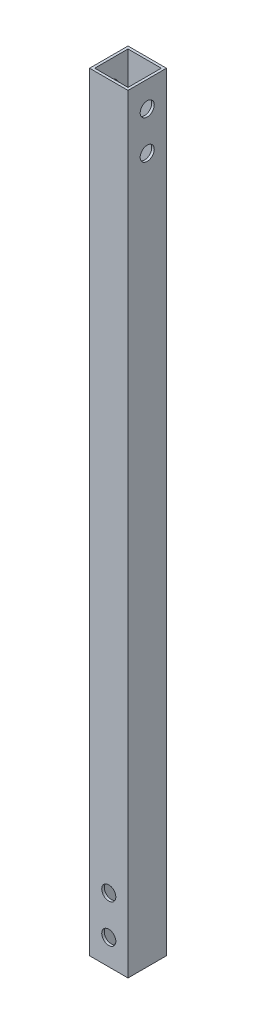
ISO-10303-21;
HEADER;
FILE_DESCRIPTION(('STEP AP214'),'2;1');
FILE_NAME('part.step','',(''),(''),'','','');
FILE_SCHEMA(('AUTOMOTIVE_DESIGN { 1 0 10303 214 1 1 1 1 }'));
ENDSEC;
DATA;
#1=APPLICATION_CONTEXT('core data for automotive mechanical design processes');
#2=APPLICATION_PROTOCOL_DEFINITION('international standard','automotive_design',2000,#1);
#3=PRODUCT_CONTEXT('',#1,'mechanical');
#4=PRODUCT('Part','Part','',(#3));
#5=PRODUCT_RELATED_PRODUCT_CATEGORY('part','',(#4));
#6=PRODUCT_DEFINITION_FORMATION('','',#4);
#7=PRODUCT_DEFINITION_CONTEXT('part definition',#1,'design');
#8=PRODUCT_DEFINITION('design','',#6,#7);
#9=PRODUCT_DEFINITION_SHAPE('','',#8);
#10=(LENGTH_UNIT() NAMED_UNIT(*) SI_UNIT(.MILLI.,.METRE.));
#11=(NAMED_UNIT(*) PLANE_ANGLE_UNIT() SI_UNIT($,.RADIAN.));
#12=(NAMED_UNIT(*) SI_UNIT($,.STERADIAN.) SOLID_ANGLE_UNIT());
#13=UNCERTAINTY_MEASURE_WITH_UNIT(LENGTH_MEASURE(1.E-05),#10,'distance_accuracy_value','');
#14=(GEOMETRIC_REPRESENTATION_CONTEXT(3) GLOBAL_UNCERTAINTY_ASSIGNED_CONTEXT((#13)) GLOBAL_UNIT_ASSIGNED_CONTEXT((#10,
#11,#12)) REPRESENTATION_CONTEXT('',''));
#15=CARTESIAN_POINT('',(0.,0.,0.));
#16=DIRECTION('',(0.,0.,1.));
#17=DIRECTION('',(1.,0.,0.));
#18=AXIS2_PLACEMENT_3D('',#15,#16,#17);
#19=CARTESIAN_POINT('',(7.5,300.,7.5));
#20=DIRECTION('',(0.,1.,0.));
#21=DIRECTION('',(0.,0.,-1.));
#22=AXIS2_PLACEMENT_3D('',#19,#20,#21);
#23=PLANE('',#22);
#24=DIRECTION('',(0.,0.,1.));
#25=VECTOR('',#24,1.);
#26=CARTESIAN_POINT('',(7.5,300.,-7.5));
#27=LINE('',#26,#25);
#28=CARTESIAN_POINT('',(7.5,300.,-7.5));
#29=VERTEX_POINT('',#28);
#30=CARTESIAN_POINT('',(7.5,300.,7.5));
#31=VERTEX_POINT('',#30);
#32=EDGE_CURVE('E154',#29,#31,#27,.T.);
#33=ORIENTED_EDGE('',*,*,#32,.F.);
#34=DIRECTION('',(1.,0.,0.));
#35=VECTOR('',#34,1.);
#36=CARTESIAN_POINT('',(7.5,300.,-7.5));
#37=LINE('',#36,#35);
#38=CARTESIAN_POINT('',(-7.5,300.,-7.5));
#39=VERTEX_POINT('',#38);
#40=EDGE_CURVE('E167',#39,#29,#37,.T.);
#41=ORIENTED_EDGE('',*,*,#40,.F.);
#42=DIRECTION('',(0.,0.,-1.));
#43=VECTOR('',#42,1.);
#44=CARTESIAN_POINT('',(-7.5,300.,-7.5));
#45=LINE('',#44,#43);
#46=CARTESIAN_POINT('',(-7.5,300.,7.5));
#47=VERTEX_POINT('',#46);
#48=EDGE_CURVE('E163',#47,#39,#45,.T.);
#49=ORIENTED_EDGE('',*,*,#48,.F.);
#50=DIRECTION('',(-1.,0.,0.));
#51=VECTOR('',#50,1.);
#52=CARTESIAN_POINT('',(7.5,300.,7.5));
#53=LINE('',#52,#51);
#54=EDGE_CURVE('E158',#31,#47,#53,.T.);
#55=ORIENTED_EDGE('',*,*,#54,.F.);
#56=EDGE_LOOP('',(#33,#41,#49,#55));
#57=FACE_BOUND('',#56,.T.);
#58=DIRECTION('',(1.,0.,0.));
#59=VECTOR('',#58,1.);
#60=CARTESIAN_POINT('',(6.5,300.,-6.5));
#61=LINE('',#60,#59);
#62=CARTESIAN_POINT('',(-6.5,300.,-6.5));
#63=VERTEX_POINT('',#62);
#64=CARTESIAN_POINT('',(6.5,300.,-6.5));
#65=VERTEX_POINT('',#64);
#66=EDGE_CURVE('E121',#63,#65,#61,.T.);
#67=ORIENTED_EDGE('',*,*,#66,.T.);
#68=DIRECTION('',(0.,0.,1.));
#69=VECTOR('',#68,1.);
#70=CARTESIAN_POINT('',(6.5,300.,-6.5));
#71=LINE('',#70,#69);
#72=CARTESIAN_POINT('',(6.5,300.,6.5));
#73=VERTEX_POINT('',#72);
#74=EDGE_CURVE('E128',#65,#73,#71,.T.);
#75=ORIENTED_EDGE('',*,*,#74,.T.);
#76=DIRECTION('',(-1.,0.,0.));
#77=VECTOR('',#76,1.);
#78=CARTESIAN_POINT('',(6.5,300.,6.5));
#79=LINE('',#78,#77);
#80=CARTESIAN_POINT('',(-6.5,300.,6.5));
#81=VERTEX_POINT('',#80);
#82=EDGE_CURVE('E122',#73,#81,#79,.T.);
#83=ORIENTED_EDGE('',*,*,#82,.T.);
#84=DIRECTION('',(0.,0.,-1.));
#85=VECTOR('',#84,1.);
#86=CARTESIAN_POINT('',(-6.5,300.,-6.5));
#87=LINE('',#86,#85);
#88=EDGE_CURVE('E106',#81,#63,#87,.T.);
#89=ORIENTED_EDGE('',*,*,#88,.T.);
#90=EDGE_LOOP('',(#67,#75,#83,#89));
#91=FACE_BOUND('',#90,.T.);
#92=ADVANCED_FACE('F17',(#57,#91),#23,.T.);
#93=CARTESIAN_POINT('',(7.5,0.,7.5));
#94=DIRECTION('',(0.,1.,0.));
#95=DIRECTION('',(0.,0.,-1.));
#96=AXIS2_PLACEMENT_3D('',#93,#94,#95);
#97=PLANE('',#96);
#98=DIRECTION('',(0.,0.,1.));
#99=VECTOR('',#98,1.);
#100=CARTESIAN_POINT('',(7.5,0.,-7.5));
#101=LINE('',#100,#99);
#102=CARTESIAN_POINT('',(7.5,0.,-7.5));
#103=VERTEX_POINT('',#102);
#104=CARTESIAN_POINT('',(7.5,0.,7.5));
#105=VERTEX_POINT('',#104);
#106=EDGE_CURVE('E115',#103,#105,#101,.T.);
#107=ORIENTED_EDGE('',*,*,#106,.T.);
#108=DIRECTION('',(-1.,0.,0.));
#109=VECTOR('',#108,1.);
#110=CARTESIAN_POINT('',(7.5,0.,7.5));
#111=LINE('',#110,#109);
#112=CARTESIAN_POINT('',(-7.5,0.,7.5));
#113=VERTEX_POINT('',#112);
#114=EDGE_CURVE('E175',#105,#113,#111,.T.);
#115=ORIENTED_EDGE('',*,*,#114,.T.);
#116=DIRECTION('',(0.,0.,-1.));
#117=VECTOR('',#116,1.);
#118=CARTESIAN_POINT('',(-7.5,0.,-7.5));
#119=LINE('',#118,#117);
#120=CARTESIAN_POINT('',(-7.5,0.,-7.5));
#121=VERTEX_POINT('',#120);
#122=EDGE_CURVE('E179',#113,#121,#119,.T.);
#123=ORIENTED_EDGE('',*,*,#122,.T.);
#124=DIRECTION('',(1.,0.,0.));
#125=VECTOR('',#124,1.);
#126=CARTESIAN_POINT('',(7.5,0.,-7.5));
#127=LINE('',#126,#125);
#128=EDGE_CURVE('E159',#121,#103,#127,.T.);
#129=ORIENTED_EDGE('',*,*,#128,.T.);
#130=EDGE_LOOP('',(#107,#115,#123,#129));
#131=FACE_BOUND('',#130,.T.);
#132=DIRECTION('',(0.,0.,-1.));
#133=VECTOR('',#132,1.);
#134=CARTESIAN_POINT('',(-6.5,0.,-6.5));
#135=LINE('',#134,#133);
#136=CARTESIAN_POINT('',(-6.5,0.,6.5));
#137=VERTEX_POINT('',#136);
#138=CARTESIAN_POINT('',(-6.5,0.,-6.5));
#139=VERTEX_POINT('',#138);
#140=EDGE_CURVE('E109',#137,#139,#135,.T.);
#141=ORIENTED_EDGE('',*,*,#140,.F.);
#142=DIRECTION('',(-1.,0.,0.));
#143=VECTOR('',#142,1.);
#144=CARTESIAN_POINT('',(6.5,0.,6.5));
#145=LINE('',#144,#143);
#146=CARTESIAN_POINT('',(6.5,0.,6.5));
#147=VERTEX_POINT('',#146);
#148=EDGE_CURVE('E124',#147,#137,#145,.T.);
#149=ORIENTED_EDGE('',*,*,#148,.F.);
#150=DIRECTION('',(0.,0.,1.));
#151=VECTOR('',#150,1.);
#152=CARTESIAN_POINT('',(6.5,0.,-6.5));
#153=LINE('',#152,#151);
#154=CARTESIAN_POINT('',(6.5,0.,-6.5));
#155=VERTEX_POINT('',#154);
#156=EDGE_CURVE('E143',#155,#147,#153,.T.);
#157=ORIENTED_EDGE('',*,*,#156,.F.);
#158=DIRECTION('',(1.,0.,0.));
#159=VECTOR('',#158,1.);
#160=CARTESIAN_POINT('',(6.5,0.,-6.5));
#161=LINE('',#160,#159);
#162=EDGE_CURVE('E139',#139,#155,#161,.T.);
#163=ORIENTED_EDGE('',*,*,#162,.F.);
#164=EDGE_LOOP('',(#141,#149,#157,#163));
#165=FACE_BOUND('',#164,.T.);
#166=ADVANCED_FACE('F269',(#131,#165),#97,.F.);
#167=CARTESIAN_POINT('',(7.5,300.,-7.5));
#168=DIRECTION('',(-1.,0.,0.));
#169=DIRECTION('',(0.,0.,-1.));
#170=AXIS2_PLACEMENT_3D('',#167,#168,#169);
#171=PLANE('',#170);
#172=CARTESIAN_POINT('',(7.5,275.,0.));
#173=DIRECTION('',(1.,0.,0.));
#174=DIRECTION('',(0.,0.,-1.));
#175=AXIS2_PLACEMENT_3D('',#172,#173,#174);
#176=CIRCLE('',#175,2.75);
#177=CARTESIAN_POINT('',(7.5,275.,-2.75));
#178=VERTEX_POINT('',#177);
#179=EDGE_CURVE('E202',#178,#178,#176,.T.);
#180=ORIENTED_EDGE('',*,*,#179,.F.);
#181=EDGE_LOOP('',(#180));
#182=FACE_BOUND('',#181,.T.);
#183=CARTESIAN_POINT('',(7.5,290.,0.));
#184=DIRECTION('',(1.,0.,0.));
#185=DIRECTION('',(0.,0.,-1.));
#186=AXIS2_PLACEMENT_3D('',#183,#184,#185);
#187=CIRCLE('',#186,2.75);
#188=CARTESIAN_POINT('',(7.5,290.,-2.75));
#189=VERTEX_POINT('',#188);
#190=EDGE_CURVE('E197',#189,#189,#187,.T.);
#191=ORIENTED_EDGE('',*,*,#190,.F.);
#192=EDGE_LOOP('',(#191));
#193=FACE_BOUND('',#192,.T.);
#194=ORIENTED_EDGE('',*,*,#106,.F.);
#195=DIRECTION('',(0.,-1.,0.));
#196=VECTOR('',#195,1.);
#197=CARTESIAN_POINT('',(7.5,300.,-7.5));
#198=LINE('',#197,#196);
#199=EDGE_CURVE('E171',#29,#103,#198,.T.);
#200=ORIENTED_EDGE('',*,*,#199,.F.);
#201=ORIENTED_EDGE('',*,*,#32,.T.);
#202=DIRECTION('',(0.,-1.,0.));
#203=VECTOR('',#202,1.);
#204=CARTESIAN_POINT('',(7.5,300.,7.5));
#205=LINE('',#204,#203);
#206=EDGE_CURVE('E11',#31,#105,#205,.T.);
#207=ORIENTED_EDGE('',*,*,#206,.T.);
#208=EDGE_LOOP('',(#194,#200,#201,#207));
#209=FACE_BOUND('',#208,.T.);
#210=ADVANCED_FACE('F19',(#182,#193,#209),#171,.F.);
#211=CARTESIAN_POINT('',(7.5,300.,7.5));
#212=DIRECTION('',(0.,0.,-1.));
#213=DIRECTION('',(1.,0.,0.));
#214=AXIS2_PLACEMENT_3D('',#211,#212,#213);
#215=PLANE('',#214);
#216=CARTESIAN_POINT('',(0.,25.,7.5));
#217=DIRECTION('',(0.,0.,1.));
#218=DIRECTION('',(1.,0.,0.));
#219=AXIS2_PLACEMENT_3D('',#216,#217,#218);
#220=CIRCLE('',#219,2.75);
#221=CARTESIAN_POINT('',(2.75,25.,7.5));
#222=VERTEX_POINT('',#221);
#223=EDGE_CURVE('E351',#222,#222,#220,.T.);
#224=ORIENTED_EDGE('',*,*,#223,.F.);
#225=EDGE_LOOP('',(#224));
#226=FACE_BOUND('',#225,.T.);
#227=CARTESIAN_POINT('',(0.,10.,7.5));
#228=DIRECTION('',(0.,0.,1.));
#229=DIRECTION('',(1.,0.,0.));
#230=AXIS2_PLACEMENT_3D('',#227,#228,#229);
#231=CIRCLE('',#230,2.75);
#232=CARTESIAN_POINT('',(2.75,10.,7.5));
#233=VERTEX_POINT('',#232);
#234=EDGE_CURVE('E207',#233,#233,#231,.T.);
#235=ORIENTED_EDGE('',*,*,#234,.F.);
#236=EDGE_LOOP('',(#235));
#237=FACE_BOUND('',#236,.T.);
#238=ORIENTED_EDGE('',*,*,#114,.F.);
#239=ORIENTED_EDGE('',*,*,#206,.F.);
#240=ORIENTED_EDGE('',*,*,#54,.T.);
#241=DIRECTION('',(0.,-1.,0.));
#242=VECTOR('',#241,1.);
#243=CARTESIAN_POINT('',(-7.5,300.,7.5));
#244=LINE('',#243,#242);
#245=EDGE_CURVE('E27',#47,#113,#244,.T.);
#246=ORIENTED_EDGE('',*,*,#245,.T.);
#247=EDGE_LOOP('',(#238,#239,#240,#246));
#248=FACE_BOUND('',#247,.T.);
#249=ADVANCED_FACE('F262',(#226,#237,#248),#215,.F.);
#250=CARTESIAN_POINT('',(-7.5,300.,-7.5));
#251=DIRECTION('',(1.,0.,0.));
#252=DIRECTION('',(0.,0.,1.));
#253=AXIS2_PLACEMENT_3D('',#250,#251,#252);
#254=PLANE('',#253);
#255=CARTESIAN_POINT('',(-7.5,275.,0.));
#256=DIRECTION('',(1.,0.,0.));
#257=DIRECTION('',(0.,0.,-1.));
#258=AXIS2_PLACEMENT_3D('',#255,#256,#257);
#259=CIRCLE('',#258,2.75);
#260=CARTESIAN_POINT('',(-7.5,275.,-2.75));
#261=VERTEX_POINT('',#260);
#262=EDGE_CURVE('E214',#261,#261,#259,.T.);
#263=ORIENTED_EDGE('',*,*,#262,.T.);
#264=EDGE_LOOP('',(#263));
#265=FACE_BOUND('',#264,.T.);
#266=CARTESIAN_POINT('',(-7.5,290.,0.));
#267=DIRECTION('',(1.,0.,0.));
#268=DIRECTION('',(0.,0.,-1.));
#269=AXIS2_PLACEMENT_3D('',#266,#267,#268);
#270=CIRCLE('',#269,2.75);
#271=CARTESIAN_POINT('',(-7.5,290.,-2.75));
#272=VERTEX_POINT('',#271);
#273=EDGE_CURVE('E238',#272,#272,#270,.T.);
#274=ORIENTED_EDGE('',*,*,#273,.T.);
#275=EDGE_LOOP('',(#274));
#276=FACE_BOUND('',#275,.T.);
#277=ORIENTED_EDGE('',*,*,#122,.F.);
#278=ORIENTED_EDGE('',*,*,#245,.F.);
#279=ORIENTED_EDGE('',*,*,#48,.T.);
#280=DIRECTION('',(0.,-1.,0.));
#281=VECTOR('',#280,1.);
#282=CARTESIAN_POINT('',(-7.5,300.,-7.5));
#283=LINE('',#282,#281);
#284=EDGE_CURVE('E188',#39,#121,#283,.T.);
#285=ORIENTED_EDGE('',*,*,#284,.T.);
#286=EDGE_LOOP('',(#277,#278,#279,#285));
#287=FACE_BOUND('',#286,.T.);
#288=ADVANCED_FACE('F258',(#265,#276,#287),#254,.F.);
#289=CARTESIAN_POINT('',(7.5,300.,-7.5));
#290=DIRECTION('',(0.,0.,1.));
#291=DIRECTION('',(-1.,0.,0.));
#292=AXIS2_PLACEMENT_3D('',#289,#290,#291);
#293=PLANE('',#292);
#294=CARTESIAN_POINT('',(0.,25.,-7.5));
#295=DIRECTION('',(0.,0.,1.));
#296=DIRECTION('',(1.,0.,0.));
#297=AXIS2_PLACEMENT_3D('',#294,#295,#296);
#298=CIRCLE('',#297,2.75);
#299=CARTESIAN_POINT('',(2.75,25.,-7.5));
#300=VERTEX_POINT('',#299);
#301=EDGE_CURVE('E307',#300,#300,#298,.T.);
#302=ORIENTED_EDGE('',*,*,#301,.T.);
#303=EDGE_LOOP('',(#302));
#304=FACE_BOUND('',#303,.T.);
#305=CARTESIAN_POINT('',(0.,10.,-7.5));
#306=DIRECTION('',(0.,0.,1.));
#307=DIRECTION('',(1.,0.,0.));
#308=AXIS2_PLACEMENT_3D('',#305,#306,#307);
#309=CIRCLE('',#308,2.75);
#310=CARTESIAN_POINT('',(2.75,10.,-7.5));
#311=VERTEX_POINT('',#310);
#312=EDGE_CURVE('E217',#311,#311,#309,.T.);
#313=ORIENTED_EDGE('',*,*,#312,.T.);
#314=EDGE_LOOP('',(#313));
#315=FACE_BOUND('',#314,.T.);
#316=ORIENTED_EDGE('',*,*,#128,.F.);
#317=ORIENTED_EDGE('',*,*,#284,.F.);
#318=ORIENTED_EDGE('',*,*,#40,.T.);
#319=ORIENTED_EDGE('',*,*,#199,.T.);
#320=EDGE_LOOP('',(#316,#317,#318,#319));
#321=FACE_BOUND('',#320,.T.);
#322=ADVANCED_FACE('F261',(#304,#315,#321),#293,.F.);
#323=CARTESIAN_POINT('',(-6.5,300.,-6.5));
#324=DIRECTION('',(1.,0.,0.));
#325=DIRECTION('',(0.,0.,1.));
#326=AXIS2_PLACEMENT_3D('',#323,#324,#325);
#327=PLANE('',#326);
#328=CARTESIAN_POINT('',(-6.5,275.,0.));
#329=DIRECTION('',(-1.,0.,0.));
#330=DIRECTION('',(0.,0.,1.));
#331=AXIS2_PLACEMENT_3D('',#328,#329,#330);
#332=CIRCLE('',#331,2.75);
#333=CARTESIAN_POINT('',(-6.5,275.,2.75));
#334=VERTEX_POINT('',#333);
#335=EDGE_CURVE('E201',#334,#334,#332,.T.);
#336=ORIENTED_EDGE('',*,*,#335,.T.);
#337=EDGE_LOOP('',(#336));
#338=FACE_BOUND('',#337,.T.);
#339=CARTESIAN_POINT('',(-6.5,290.,0.));
#340=DIRECTION('',(-1.,0.,0.));
#341=DIRECTION('',(0.,0.,1.));
#342=AXIS2_PLACEMENT_3D('',#339,#340,#341);
#343=CIRCLE('',#342,2.75);
#344=CARTESIAN_POINT('',(-6.5,290.,2.75));
#345=VERTEX_POINT('',#344);
#346=EDGE_CURVE('E140',#345,#345,#343,.T.);
#347=ORIENTED_EDGE('',*,*,#346,.T.);
#348=EDGE_LOOP('',(#347));
#349=FACE_BOUND('',#348,.T.);
#350=ORIENTED_EDGE('',*,*,#140,.T.);
#351=DIRECTION('',(0.,-1.,0.));
#352=VECTOR('',#351,1.);
#353=CARTESIAN_POINT('',(-6.5,300.,-6.5));
#354=LINE('',#353,#352);
#355=EDGE_CURVE('E103',#63,#139,#354,.T.);
#356=ORIENTED_EDGE('',*,*,#355,.F.);
#357=ORIENTED_EDGE('',*,*,#88,.F.);
#358=DIRECTION('',(0.,-1.,0.));
#359=VECTOR('',#358,1.);
#360=CARTESIAN_POINT('',(-6.5,300.,6.5));
#361=LINE('',#360,#359);
#362=EDGE_CURVE('E49',#81,#137,#361,.T.);
#363=ORIENTED_EDGE('',*,*,#362,.T.);
#364=EDGE_LOOP('',(#350,#356,#357,#363));
#365=FACE_BOUND('',#364,.T.);
#366=ADVANCED_FACE('F105',(#338,#349,#365),#327,.T.);
#367=CARTESIAN_POINT('',(6.5,300.,-6.5));
#368=DIRECTION('',(0.,0.,1.));
#369=DIRECTION('',(-1.,0.,0.));
#370=AXIS2_PLACEMENT_3D('',#367,#368,#369);
#371=PLANE('',#370);
#372=CARTESIAN_POINT('',(0.,25.,-6.5));
#373=DIRECTION('',(0.,0.,-1.));
#374=DIRECTION('',(-1.,0.,0.));
#375=AXIS2_PLACEMENT_3D('',#372,#373,#374);
#376=CIRCLE('',#375,2.75);
#377=CARTESIAN_POINT('',(-2.75,25.,-6.5));
#378=VERTEX_POINT('',#377);
#379=EDGE_CURVE('E224',#378,#378,#376,.T.);
#380=ORIENTED_EDGE('',*,*,#379,.T.);
#381=EDGE_LOOP('',(#380));
#382=FACE_BOUND('',#381,.T.);
#383=CARTESIAN_POINT('',(0.,10.,-6.5));
#384=DIRECTION('',(0.,0.,-1.));
#385=DIRECTION('',(-1.,0.,0.));
#386=AXIS2_PLACEMENT_3D('',#383,#384,#385);
#387=CIRCLE('',#386,2.75);
#388=CARTESIAN_POINT('',(-2.75,10.,-6.5));
#389=VERTEX_POINT('',#388);
#390=EDGE_CURVE('E206',#389,#389,#387,.T.);
#391=ORIENTED_EDGE('',*,*,#390,.T.);
#392=EDGE_LOOP('',(#391));
#393=FACE_BOUND('',#392,.T.);
#394=ORIENTED_EDGE('',*,*,#162,.T.);
#395=DIRECTION('',(0.,-1.,0.));
#396=VECTOR('',#395,1.);
#397=CARTESIAN_POINT('',(6.5,300.,-6.5));
#398=LINE('',#397,#396);
#399=EDGE_CURVE('E116',#65,#155,#398,.T.);
#400=ORIENTED_EDGE('',*,*,#399,.F.);
#401=ORIENTED_EDGE('',*,*,#66,.F.);
#402=ORIENTED_EDGE('',*,*,#355,.T.);
#403=EDGE_LOOP('',(#394,#400,#401,#402));
#404=FACE_BOUND('',#403,.T.);
#405=ADVANCED_FACE('F126',(#382,#393,#404),#371,.T.);
#406=CARTESIAN_POINT('',(6.5,300.,-6.5));
#407=DIRECTION('',(-1.,0.,0.));
#408=DIRECTION('',(0.,0.,-1.));
#409=AXIS2_PLACEMENT_3D('',#406,#407,#408);
#410=PLANE('',#409);
#411=CARTESIAN_POINT('',(6.5,275.,0.));
#412=DIRECTION('',(1.,0.,0.));
#413=DIRECTION('',(0.,0.,-1.));
#414=AXIS2_PLACEMENT_3D('',#411,#412,#413);
#415=CIRCLE('',#414,2.75);
#416=CARTESIAN_POINT('',(6.5,275.,-2.75));
#417=VERTEX_POINT('',#416);
#418=EDGE_CURVE('E198',#417,#417,#415,.T.);
#419=ORIENTED_EDGE('',*,*,#418,.T.);
#420=EDGE_LOOP('',(#419));
#421=FACE_BOUND('',#420,.T.);
#422=CARTESIAN_POINT('',(6.5,290.,0.));
#423=DIRECTION('',(1.,0.,0.));
#424=DIRECTION('',(0.,0.,-1.));
#425=AXIS2_PLACEMENT_3D('',#422,#423,#424);
#426=CIRCLE('',#425,2.75);
#427=CARTESIAN_POINT('',(6.5,290.,-2.75));
#428=VERTEX_POINT('',#427);
#429=EDGE_CURVE('E193',#428,#428,#426,.T.);
#430=ORIENTED_EDGE('',*,*,#429,.T.);
#431=EDGE_LOOP('',(#430));
#432=FACE_BOUND('',#431,.T.);
#433=ORIENTED_EDGE('',*,*,#156,.T.);
#434=DIRECTION('',(0.,-1.,0.));
#435=VECTOR('',#434,1.);
#436=CARTESIAN_POINT('',(6.5,300.,6.5));
#437=LINE('',#436,#435);
#438=EDGE_CURVE('E39',#73,#147,#437,.T.);
#439=ORIENTED_EDGE('',*,*,#438,.F.);
#440=ORIENTED_EDGE('',*,*,#74,.F.);
#441=ORIENTED_EDGE('',*,*,#399,.T.);
#442=EDGE_LOOP('',(#433,#439,#440,#441));
#443=FACE_BOUND('',#442,.T.);
#444=ADVANCED_FACE('F335',(#421,#432,#443),#410,.T.);
#445=CARTESIAN_POINT('',(6.5,300.,6.5));
#446=DIRECTION('',(0.,0.,-1.));
#447=DIRECTION('',(1.,0.,0.));
#448=AXIS2_PLACEMENT_3D('',#445,#446,#447);
#449=PLANE('',#448);
#450=CARTESIAN_POINT('',(0.,25.,6.5));
#451=DIRECTION('',(0.,0.,1.));
#452=DIRECTION('',(1.,0.,0.));
#453=AXIS2_PLACEMENT_3D('',#450,#451,#452);
#454=CIRCLE('',#453,2.75);
#455=CARTESIAN_POINT('',(2.75,25.,6.5));
#456=VERTEX_POINT('',#455);
#457=EDGE_CURVE('E21',#456,#456,#454,.T.);
#458=ORIENTED_EDGE('',*,*,#457,.T.);
#459=EDGE_LOOP('',(#458));
#460=FACE_BOUND('',#459,.T.);
#461=CARTESIAN_POINT('',(0.,10.,6.5));
#462=DIRECTION('',(0.,0.,1.));
#463=DIRECTION('',(1.,0.,0.));
#464=AXIS2_PLACEMENT_3D('',#461,#462,#463);
#465=CIRCLE('',#464,2.75);
#466=CARTESIAN_POINT('',(2.75,10.,6.5));
#467=VERTEX_POINT('',#466);
#468=EDGE_CURVE('E203',#467,#467,#465,.T.);
#469=ORIENTED_EDGE('',*,*,#468,.T.);
#470=EDGE_LOOP('',(#469));
#471=FACE_BOUND('',#470,.T.);
#472=ORIENTED_EDGE('',*,*,#148,.T.);
#473=ORIENTED_EDGE('',*,*,#362,.F.);
#474=ORIENTED_EDGE('',*,*,#82,.F.);
#475=ORIENTED_EDGE('',*,*,#438,.T.);
#476=EDGE_LOOP('',(#472,#473,#474,#475));
#477=FACE_BOUND('',#476,.T.);
#478=ADVANCED_FACE('F331',(#460,#471,#477),#449,.T.);
#479=CARTESIAN_POINT('',(7.5,290.,0.));
#480=DIRECTION('',(-1.,0.,0.));
#481=DIRECTION('',(0.,0.,-1.));
#482=AXIS2_PLACEMENT_3D('',#479,#480,#481);
#483=CYLINDRICAL_SURFACE('',#482,2.75);
#484=ORIENTED_EDGE('',*,*,#429,.F.);
#485=EDGE_LOOP('',(#484));
#486=FACE_BOUND('',#485,.T.);
#487=ORIENTED_EDGE('',*,*,#190,.T.);
#488=EDGE_LOOP('',(#487));
#489=FACE_BOUND('',#488,.T.);
#490=ADVANCED_FACE('F254',(#486,#489),#483,.F.);
#491=ORIENTED_EDGE('',*,*,#346,.F.);
#492=EDGE_LOOP('',(#491));
#493=FACE_BOUND('',#492,.T.);
#494=ORIENTED_EDGE('',*,*,#273,.F.);
#495=EDGE_LOOP('',(#494));
#496=FACE_BOUND('',#495,.T.);
#497=ADVANCED_FACE('F250',(#493,#496),#483,.F.);
#498=CARTESIAN_POINT('',(7.5,275.,0.));
#499=DIRECTION('',(-1.,0.,0.));
#500=DIRECTION('',(0.,0.,-1.));
#501=AXIS2_PLACEMENT_3D('',#498,#499,#500);
#502=CYLINDRICAL_SURFACE('',#501,2.75);
#503=ORIENTED_EDGE('',*,*,#418,.F.);
#504=EDGE_LOOP('',(#503));
#505=FACE_BOUND('',#504,.T.);
#506=ORIENTED_EDGE('',*,*,#179,.T.);
#507=EDGE_LOOP('',(#506));
#508=FACE_BOUND('',#507,.T.);
#509=ADVANCED_FACE('F253',(#505,#508),#502,.F.);
#510=ORIENTED_EDGE('',*,*,#335,.F.);
#511=EDGE_LOOP('',(#510));
#512=FACE_BOUND('',#511,.T.);
#513=ORIENTED_EDGE('',*,*,#262,.F.);
#514=EDGE_LOOP('',(#513));
#515=FACE_BOUND('',#514,.T.);
#516=ADVANCED_FACE('F323',(#512,#515),#502,.F.);
#517=CARTESIAN_POINT('',(0.,10.,7.5));
#518=DIRECTION('',(0.,0.,-1.));
#519=DIRECTION('',(1.,0.,0.));
#520=AXIS2_PLACEMENT_3D('',#517,#518,#519);
#521=CYLINDRICAL_SURFACE('',#520,2.75);
#522=ORIENTED_EDGE('',*,*,#468,.F.);
#523=EDGE_LOOP('',(#522));
#524=FACE_BOUND('',#523,.T.);
#525=ORIENTED_EDGE('',*,*,#234,.T.);
#526=EDGE_LOOP('',(#525));
#527=FACE_BOUND('',#526,.T.);
#528=ADVANCED_FACE('F313',(#524,#527),#521,.F.);
#529=ORIENTED_EDGE('',*,*,#390,.F.);
#530=EDGE_LOOP('',(#529));
#531=FACE_BOUND('',#530,.T.);
#532=ORIENTED_EDGE('',*,*,#312,.F.);
#533=EDGE_LOOP('',(#532));
#534=FACE_BOUND('',#533,.T.);
#535=ADVANCED_FACE('F310',(#531,#534),#521,.F.);
#536=CARTESIAN_POINT('',(0.,25.,7.5));
#537=DIRECTION('',(0.,0.,-1.));
#538=DIRECTION('',(1.,0.,0.));
#539=AXIS2_PLACEMENT_3D('',#536,#537,#538);
#540=CYLINDRICAL_SURFACE('',#539,2.75);
#541=ORIENTED_EDGE('',*,*,#457,.F.);
#542=EDGE_LOOP('',(#541));
#543=FACE_BOUND('',#542,.T.);
#544=ORIENTED_EDGE('',*,*,#223,.T.);
#545=EDGE_LOOP('',(#544));
#546=FACE_BOUND('',#545,.T.);
#547=ADVANCED_FACE('F312',(#543,#546),#540,.F.);
#548=ORIENTED_EDGE('',*,*,#379,.F.);
#549=EDGE_LOOP('',(#548));
#550=FACE_BOUND('',#549,.T.);
#551=ORIENTED_EDGE('',*,*,#301,.F.);
#552=EDGE_LOOP('',(#551));
#553=FACE_BOUND('',#552,.T.);
#554=ADVANCED_FACE('F320',(#550,#553),#540,.F.);
#555=CLOSED_SHELL('',(#92,#166,#210,#249,#288,#322,#366,#405,#444,#478,#490,#497,#509,#516,#528,
#535,#547,#554));
#556=MANIFOLD_SOLID_BREP('B1',#555);
#557=ADVANCED_BREP_SHAPE_REPRESENTATION('',(#18,#556),#14);
#558=SHAPE_DEFINITION_REPRESENTATION(#9,#557);
ENDSEC;
END-ISO-10303-21;
